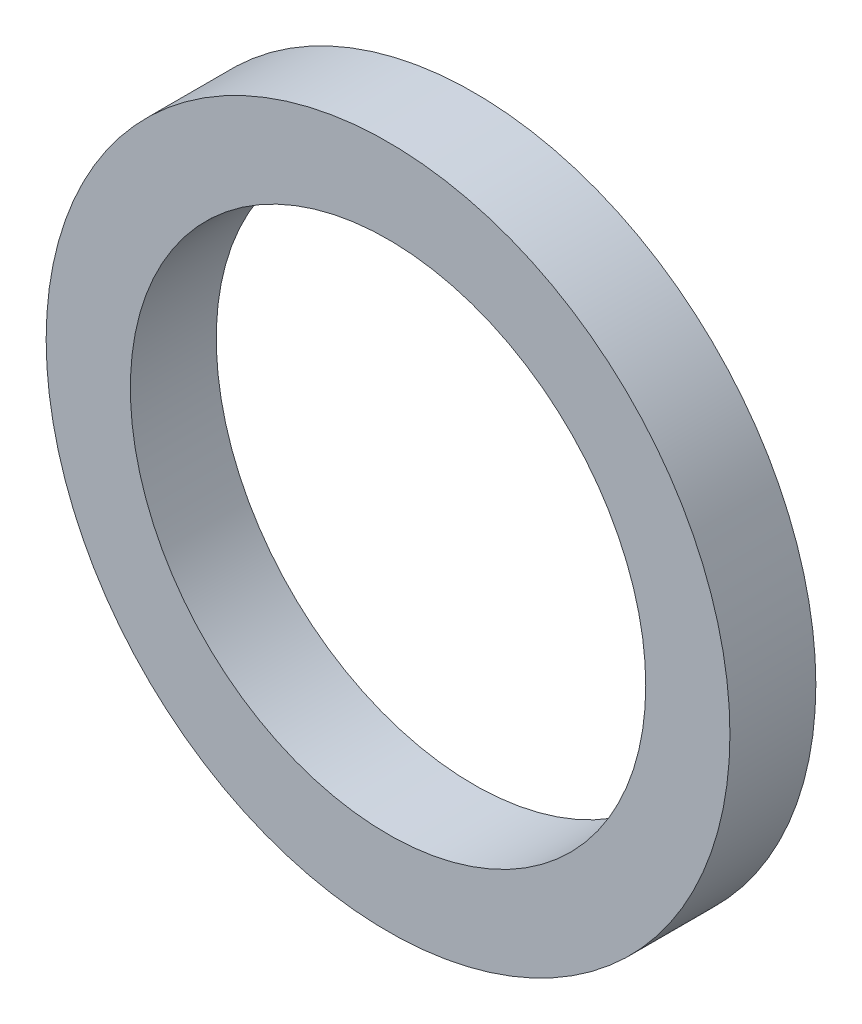
ISO-10303-21;
HEADER;
FILE_DESCRIPTION(('STEP AP214'),'2;1');
FILE_NAME('part.step','',(''),(''),'','','');
FILE_SCHEMA(('AUTOMOTIVE_DESIGN { 1 0 10303 214 1 1 1 1 }'));
ENDSEC;
DATA;
#1=APPLICATION_CONTEXT('core data for automotive mechanical design processes');
#2=APPLICATION_PROTOCOL_DEFINITION('international standard','automotive_design',2000,#1);
#3=PRODUCT_CONTEXT('',#1,'mechanical');
#4=PRODUCT('Part','Part','',(#3));
#5=PRODUCT_RELATED_PRODUCT_CATEGORY('part','',(#4));
#6=PRODUCT_DEFINITION_FORMATION('','',#4);
#7=PRODUCT_DEFINITION_CONTEXT('part definition',#1,'design');
#8=PRODUCT_DEFINITION('design','',#6,#7);
#9=PRODUCT_DEFINITION_SHAPE('','',#8);
#10=(LENGTH_UNIT() NAMED_UNIT(*) SI_UNIT(.MILLI.,.METRE.));
#11=(NAMED_UNIT(*) PLANE_ANGLE_UNIT() SI_UNIT($,.RADIAN.));
#12=(NAMED_UNIT(*) SI_UNIT($,.STERADIAN.) SOLID_ANGLE_UNIT());
#13=UNCERTAINTY_MEASURE_WITH_UNIT(LENGTH_MEASURE(1.E-05),#10,'distance_accuracy_value','');
#14=(GEOMETRIC_REPRESENTATION_CONTEXT(3) GLOBAL_UNCERTAINTY_ASSIGNED_CONTEXT((#13)) GLOBAL_UNIT_ASSIGNED_CONTEXT((#10,
#11,#12)) REPRESENTATION_CONTEXT('',''));
#15=CARTESIAN_POINT('',(0.,0.,0.));
#16=DIRECTION('',(0.,0.,1.));
#17=DIRECTION('',(1.,0.,0.));
#18=AXIS2_PLACEMENT_3D('',#15,#16,#17);
#19=CARTESIAN_POINT('',(0.,0.,6.35));
#20=DIRECTION('',(0.,0.,-1.));
#21=DIRECTION('',(-1.,0.,0.));
#22=AXIS2_PLACEMENT_3D('',#19,#20,#21);
#23=CYLINDRICAL_SURFACE('',#22,25.273);
#24=CARTESIAN_POINT('',(0.,0.,6.35));
#25=DIRECTION('',(0.,0.,1.));
#26=DIRECTION('',(1.,0.,0.));
#27=AXIS2_PLACEMENT_3D('',#24,#25,#26);
#28=CIRCLE('',#27,25.273);
#29=CARTESIAN_POINT('',(25.273,0.,6.35));
#30=VERTEX_POINT('',#29);
#31=EDGE_CURVE('E10',#30,#30,#28,.T.);
#32=ORIENTED_EDGE('',*,*,#31,.F.);
#33=EDGE_LOOP('',(#32));
#34=FACE_BOUND('',#33,.T.);
#35=CARTESIAN_POINT('',(0.,0.,0.));
#36=DIRECTION('',(0.,0.,1.));
#37=DIRECTION('',(1.,0.,0.));
#38=AXIS2_PLACEMENT_3D('',#35,#36,#37);
#39=CIRCLE('',#38,25.273);
#40=CARTESIAN_POINT('',(25.273,0.,0.));
#41=VERTEX_POINT('',#40);
#42=EDGE_CURVE('E40',#41,#41,#39,.T.);
#43=ORIENTED_EDGE('',*,*,#42,.T.);
#44=EDGE_LOOP('',(#43));
#45=FACE_BOUND('',#44,.T.);
#46=ADVANCED_FACE('F37',(#34,#45),#23,.T.);
#47=CARTESIAN_POINT('',(0.,0.,6.35));
#48=DIRECTION('',(0.,0.,1.));
#49=DIRECTION('',(1.,0.,0.));
#50=AXIS2_PLACEMENT_3D('',#47,#48,#49);
#51=PLANE('',#50);
#52=CARTESIAN_POINT('',(0.,0.,6.35));
#53=DIRECTION('',(0.,0.,1.));
#54=DIRECTION('',(1.,0.,0.));
#55=AXIS2_PLACEMENT_3D('',#52,#53,#54);
#56=CIRCLE('',#55,19.05);
#57=CARTESIAN_POINT('',(19.05,0.,6.35));
#58=VERTEX_POINT('',#57);
#59=EDGE_CURVE('E49',#58,#58,#56,.T.);
#60=ORIENTED_EDGE('',*,*,#59,.F.);
#61=EDGE_LOOP('',(#60));
#62=FACE_BOUND('',#61,.T.);
#63=ORIENTED_EDGE('',*,*,#31,.T.);
#64=EDGE_LOOP('',(#63));
#65=FACE_BOUND('',#64,.T.);
#66=ADVANCED_FACE('F64',(#62,#65),#51,.T.);
#67=CARTESIAN_POINT('',(0.,0.,0.));
#68=DIRECTION('',(0.,0.,1.));
#69=DIRECTION('',(1.,0.,0.));
#70=AXIS2_PLACEMENT_3D('',#67,#68,#69);
#71=PLANE('',#70);
#72=CARTESIAN_POINT('',(0.,0.,0.));
#73=DIRECTION('',(0.,0.,1.));
#74=DIRECTION('',(1.,0.,0.));
#75=AXIS2_PLACEMENT_3D('',#72,#73,#74);
#76=CIRCLE('',#75,19.05);
#77=CARTESIAN_POINT('',(19.05,0.,0.));
#78=VERTEX_POINT('',#77);
#79=EDGE_CURVE('E47',#78,#78,#76,.T.);
#80=ORIENTED_EDGE('',*,*,#79,.T.);
#81=EDGE_LOOP('',(#80));
#82=FACE_BOUND('',#81,.T.);
#83=ORIENTED_EDGE('',*,*,#42,.F.);
#84=EDGE_LOOP('',(#83));
#85=FACE_BOUND('',#84,.T.);
#86=ADVANCED_FACE('F55',(#82,#85),#71,.F.);
#87=CARTESIAN_POINT('',(0.,0.,0.));
#88=DIRECTION('',(0.,0.,1.));
#89=DIRECTION('',(1.,0.,0.));
#90=AXIS2_PLACEMENT_3D('',#87,#88,#89);
#91=CYLINDRICAL_SURFACE('',#90,19.05);
#92=ORIENTED_EDGE('',*,*,#79,.F.);
#93=EDGE_LOOP('',(#92));
#94=FACE_BOUND('',#93,.T.);
#95=ORIENTED_EDGE('',*,*,#59,.T.);
#96=EDGE_LOOP('',(#95));
#97=FACE_BOUND('',#96,.T.);
#98=ADVANCED_FACE('F58',(#94,#97),#91,.F.);
#99=CLOSED_SHELL('',(#46,#66,#86,#98));
#100=MANIFOLD_SOLID_BREP('B2',#99);
#101=ADVANCED_BREP_SHAPE_REPRESENTATION('',(#18,#100),#14);
#102=SHAPE_DEFINITION_REPRESENTATION(#9,#101);
ENDSEC;
END-ISO-10303-21;
